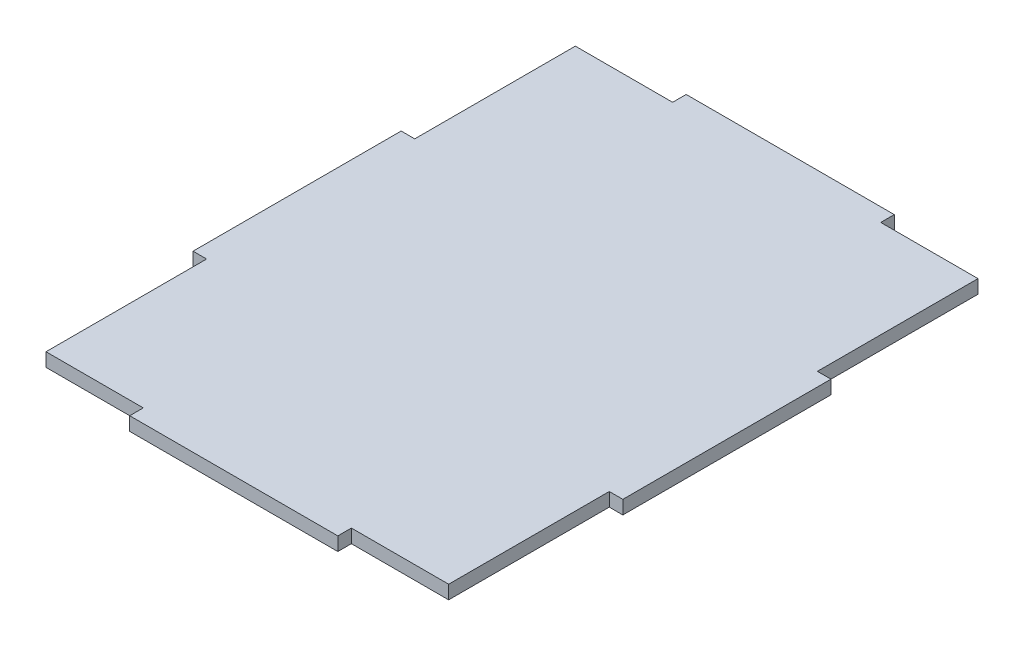
ISO-10303-21;
HEADER;
FILE_DESCRIPTION(('STEP AP214'),'2;1');
FILE_NAME('part.step','',(''),(''),'','','');
FILE_SCHEMA(('AUTOMOTIVE_DESIGN { 1 0 10303 214 1 1 1 1 }'));
ENDSEC;
DATA;
#1=APPLICATION_CONTEXT('core data for automotive mechanical design processes');
#2=APPLICATION_PROTOCOL_DEFINITION('international standard','automotive_design',2000,#1);
#3=PRODUCT_CONTEXT('',#1,'mechanical');
#4=PRODUCT('Part','Part','',(#3));
#5=PRODUCT_RELATED_PRODUCT_CATEGORY('part','',(#4));
#6=PRODUCT_DEFINITION_FORMATION('','',#4);
#7=PRODUCT_DEFINITION_CONTEXT('part definition',#1,'design');
#8=PRODUCT_DEFINITION('design','',#6,#7);
#9=PRODUCT_DEFINITION_SHAPE('','',#8);
#10=(LENGTH_UNIT() NAMED_UNIT(*) SI_UNIT(.MILLI.,.METRE.));
#11=(NAMED_UNIT(*) PLANE_ANGLE_UNIT() SI_UNIT($,.RADIAN.));
#12=(NAMED_UNIT(*) SI_UNIT($,.STERADIAN.) SOLID_ANGLE_UNIT());
#13=UNCERTAINTY_MEASURE_WITH_UNIT(LENGTH_MEASURE(1.E-05),#10,'distance_accuracy_value','');
#14=(GEOMETRIC_REPRESENTATION_CONTEXT(3) GLOBAL_UNCERTAINTY_ASSIGNED_CONTEXT((#13)) GLOBAL_UNIT_ASSIGNED_CONTEXT((#10,
#11,#12)) REPRESENTATION_CONTEXT('',''));
#15=CARTESIAN_POINT('',(0.,0.,0.));
#16=DIRECTION('',(0.,0.,1.));
#17=DIRECTION('',(1.,0.,0.));
#18=AXIS2_PLACEMENT_3D('',#15,#16,#17);
#19=CARTESIAN_POINT('',(0.,3.,-38.5));
#20=DIRECTION('',(0.,0.,-1.));
#21=DIRECTION('',(-1.,0.,0.));
#22=AXIS2_PLACEMENT_3D('',#19,#20,#21);
#23=PLANE('',#22);
#24=DIRECTION('',(1.,0.,0.));
#25=VECTOR('',#24,1.);
#26=CARTESIAN_POINT('',(0.,0.,-38.5));
#27=LINE('',#26,#25);
#28=CARTESIAN_POINT('',(0.,0.,-38.5));
#29=VERTEX_POINT('',#28);
#30=CARTESIAN_POINT('',(3.,0.,-38.5));
#31=VERTEX_POINT('',#30);
#32=EDGE_CURVE('E212',#29,#31,#27,.T.);
#33=ORIENTED_EDGE('',*,*,#32,.T.);
#34=DIRECTION('',(0.,-1.,0.));
#35=VECTOR('',#34,1.);
#36=CARTESIAN_POINT('',(3.,3.,-38.5));
#37=LINE('',#36,#35);
#38=CARTESIAN_POINT('',(3.,3.,-38.5));
#39=VERTEX_POINT('',#38);
#40=EDGE_CURVE('E11',#39,#31,#37,.T.);
#41=ORIENTED_EDGE('',*,*,#40,.F.);
#42=DIRECTION('',(1.,0.,0.));
#43=VECTOR('',#42,1.);
#44=CARTESIAN_POINT('',(0.,3.,-38.5));
#45=LINE('',#44,#43);
#46=CARTESIAN_POINT('',(0.,3.,-38.5));
#47=VERTEX_POINT('',#46);
#48=EDGE_CURVE('E270',#47,#39,#45,.T.);
#49=ORIENTED_EDGE('',*,*,#48,.F.);
#50=DIRECTION('',(0.,-1.,0.));
#51=VECTOR('',#50,1.);
#52=CARTESIAN_POINT('',(0.,3.,-38.5));
#53=LINE('',#52,#51);
#54=EDGE_CURVE('E208',#47,#29,#53,.T.);
#55=ORIENTED_EDGE('',*,*,#54,.T.);
#56=EDGE_LOOP('',(#33,#41,#49,#55));
#57=FACE_BOUND('',#56,.T.);
#58=ADVANCED_FACE('F39',(#57),#23,.F.);
#59=CARTESIAN_POINT('',(3.,3.,-38.5));
#60=DIRECTION('',(1.,0.,0.));
#61=DIRECTION('',(0.,0.,-1.));
#62=AXIS2_PLACEMENT_3D('',#59,#60,#61);
#63=PLANE('',#62);
#64=DIRECTION('',(0.,0.,1.));
#65=VECTOR('',#64,1.);
#66=CARTESIAN_POINT('',(3.,0.,-38.5));
#67=LINE('',#66,#65);
#68=CARTESIAN_POINT('',(3.,0.,-3.));
#69=VERTEX_POINT('',#68);
#70=EDGE_CURVE('E216',#31,#69,#67,.T.);
#71=ORIENTED_EDGE('',*,*,#70,.T.);
#72=DIRECTION('',(0.,-1.,0.));
#73=VECTOR('',#72,1.);
#74=CARTESIAN_POINT('',(3.,3.,-3.));
#75=LINE('',#74,#73);
#76=CARTESIAN_POINT('',(3.,3.,-3.));
#77=VERTEX_POINT('',#76);
#78=EDGE_CURVE('E48',#77,#69,#75,.T.);
#79=ORIENTED_EDGE('',*,*,#78,.F.);
#80=DIRECTION('',(0.,0.,1.));
#81=VECTOR('',#80,1.);
#82=CARTESIAN_POINT('',(3.,3.,-38.5));
#83=LINE('',#82,#81);
#84=EDGE_CURVE('E135',#39,#77,#83,.T.);
#85=ORIENTED_EDGE('',*,*,#84,.F.);
#86=ORIENTED_EDGE('',*,*,#40,.T.);
#87=EDGE_LOOP('',(#71,#79,#85,#86));
#88=FACE_BOUND('',#87,.T.);
#89=ADVANCED_FACE('F420',(#88),#63,.F.);
#90=CARTESIAN_POINT('',(3.,3.,-3.));
#91=DIRECTION('',(0.,0.,-1.));
#92=DIRECTION('',(-1.,0.,0.));
#93=AXIS2_PLACEMENT_3D('',#90,#91,#92);
#94=PLANE('',#93);
#95=DIRECTION('',(1.,0.,0.));
#96=VECTOR('',#95,1.);
#97=CARTESIAN_POINT('',(3.,0.,-3.));
#98=LINE('',#97,#96);
#99=CARTESIAN_POINT('',(24.5,0.,-3.));
#100=VERTEX_POINT('',#99);
#101=EDGE_CURVE('E219',#69,#100,#98,.T.);
#102=ORIENTED_EDGE('',*,*,#101,.T.);
#103=DIRECTION('',(0.,-1.,0.));
#104=VECTOR('',#103,1.);
#105=CARTESIAN_POINT('',(24.5,3.,-3.));
#106=LINE('',#105,#104);
#107=CARTESIAN_POINT('',(24.5,3.,-3.));
#108=VERTEX_POINT('',#107);
#109=EDGE_CURVE('E329',#108,#100,#106,.T.);
#110=ORIENTED_EDGE('',*,*,#109,.F.);
#111=DIRECTION('',(1.,0.,0.));
#112=VECTOR('',#111,1.);
#113=CARTESIAN_POINT('',(3.,3.,-3.));
#114=LINE('',#113,#112);
#115=EDGE_CURVE('E339',#77,#108,#114,.T.);
#116=ORIENTED_EDGE('',*,*,#115,.F.);
#117=ORIENTED_EDGE('',*,*,#78,.T.);
#118=EDGE_LOOP('',(#102,#110,#116,#117));
#119=FACE_BOUND('',#118,.T.);
#120=ADVANCED_FACE('F337',(#119),#94,.F.);
#121=CARTESIAN_POINT('',(24.5,3.,-3.));
#122=DIRECTION('',(1.,0.,0.));
#123=DIRECTION('',(0.,0.,-1.));
#124=AXIS2_PLACEMENT_3D('',#121,#122,#123);
#125=PLANE('',#124);
#126=DIRECTION('',(0.,0.,1.));
#127=VECTOR('',#126,1.);
#128=CARTESIAN_POINT('',(24.5,0.,-3.));
#129=LINE('',#128,#127);
#130=CARTESIAN_POINT('',(24.5,0.,0.));
#131=VERTEX_POINT('',#130);
#132=EDGE_CURVE('E222',#100,#131,#129,.T.);
#133=ORIENTED_EDGE('',*,*,#132,.T.);
#134=DIRECTION('',(0.,-1.,0.));
#135=VECTOR('',#134,1.);
#136=CARTESIAN_POINT('',(24.5,3.,0.));
#137=LINE('',#136,#135);
#138=CARTESIAN_POINT('',(24.5,3.,0.));
#139=VERTEX_POINT('',#138);
#140=EDGE_CURVE('E325',#139,#131,#137,.T.);
#141=ORIENTED_EDGE('',*,*,#140,.F.);
#142=DIRECTION('',(0.,0.,1.));
#143=VECTOR('',#142,1.);
#144=CARTESIAN_POINT('',(24.5,3.,-3.));
#145=LINE('',#144,#143);
#146=EDGE_CURVE('E358',#108,#139,#145,.T.);
#147=ORIENTED_EDGE('',*,*,#146,.F.);
#148=ORIENTED_EDGE('',*,*,#109,.T.);
#149=EDGE_LOOP('',(#133,#141,#147,#148));
#150=FACE_BOUND('',#149,.T.);
#151=ADVANCED_FACE('F348',(#150),#125,.F.);
#152=CARTESIAN_POINT('',(24.5,3.,0.));
#153=DIRECTION('',(0.,0.,-1.));
#154=DIRECTION('',(-1.,0.,0.));
#155=AXIS2_PLACEMENT_3D('',#152,#153,#154);
#156=PLANE('',#155);
#157=DIRECTION('',(1.,0.,0.));
#158=VECTOR('',#157,1.);
#159=CARTESIAN_POINT('',(24.5,0.,0.));
#160=LINE('',#159,#158);
#161=CARTESIAN_POINT('',(70.5,0.,0.));
#162=VERTEX_POINT('',#161);
#163=EDGE_CURVE('E225',#131,#162,#160,.T.);
#164=ORIENTED_EDGE('',*,*,#163,.T.);
#165=DIRECTION('',(0.,-1.,0.));
#166=VECTOR('',#165,1.);
#167=CARTESIAN_POINT('',(70.5,3.,0.));
#168=LINE('',#167,#166);
#169=CARTESIAN_POINT('',(70.5,3.,0.));
#170=VERTEX_POINT('',#169);
#171=EDGE_CURVE('E321',#170,#162,#168,.T.);
#172=ORIENTED_EDGE('',*,*,#171,.F.);
#173=DIRECTION('',(1.,0.,0.));
#174=VECTOR('',#173,1.);
#175=CARTESIAN_POINT('',(24.5,3.,0.));
#176=LINE('',#175,#174);
#177=EDGE_CURVE('E354',#139,#170,#176,.T.);
#178=ORIENTED_EDGE('',*,*,#177,.F.);
#179=ORIENTED_EDGE('',*,*,#140,.T.);
#180=EDGE_LOOP('',(#164,#172,#178,#179));
#181=FACE_BOUND('',#180,.T.);
#182=ADVANCED_FACE('F352',(#181),#156,.F.);
#183=CARTESIAN_POINT('',(70.5,3.,0.));
#184=DIRECTION('',(-1.,0.,0.));
#185=DIRECTION('',(0.,0.,1.));
#186=AXIS2_PLACEMENT_3D('',#183,#184,#185);
#187=PLANE('',#186);
#188=DIRECTION('',(0.,0.,-1.));
#189=VECTOR('',#188,1.);
#190=CARTESIAN_POINT('',(70.5,0.,0.));
#191=LINE('',#190,#189);
#192=CARTESIAN_POINT('',(70.5,0.,-3.));
#193=VERTEX_POINT('',#192);
#194=EDGE_CURVE('E228',#162,#193,#191,.T.);
#195=ORIENTED_EDGE('',*,*,#194,.T.);
#196=DIRECTION('',(0.,-1.,0.));
#197=VECTOR('',#196,1.);
#198=CARTESIAN_POINT('',(70.5,3.,-3.));
#199=LINE('',#198,#197);
#200=CARTESIAN_POINT('',(70.5,3.,-3.));
#201=VERTEX_POINT('',#200);
#202=EDGE_CURVE('E317',#201,#193,#199,.T.);
#203=ORIENTED_EDGE('',*,*,#202,.F.);
#204=DIRECTION('',(0.,0.,-1.));
#205=VECTOR('',#204,1.);
#206=CARTESIAN_POINT('',(70.5,3.,0.));
#207=LINE('',#206,#205);
#208=EDGE_CURVE('E357',#170,#201,#207,.T.);
#209=ORIENTED_EDGE('',*,*,#208,.F.);
#210=ORIENTED_EDGE('',*,*,#171,.T.);
#211=EDGE_LOOP('',(#195,#203,#209,#210));
#212=FACE_BOUND('',#211,.T.);
#213=ADVANCED_FACE('F433',(#212),#187,.F.);
#214=CARTESIAN_POINT('',(70.5,3.,-3.));
#215=DIRECTION('',(0.,0.,-1.));
#216=DIRECTION('',(-1.,0.,0.));
#217=AXIS2_PLACEMENT_3D('',#214,#215,#216);
#218=PLANE('',#217);
#219=DIRECTION('',(1.,0.,0.));
#220=VECTOR('',#219,1.);
#221=CARTESIAN_POINT('',(70.5,0.,-3.));
#222=LINE('',#221,#220);
#223=CARTESIAN_POINT('',(92.,0.,-3.));
#224=VERTEX_POINT('',#223);
#225=EDGE_CURVE('E231',#193,#224,#222,.T.);
#226=ORIENTED_EDGE('',*,*,#225,.T.);
#227=DIRECTION('',(0.,-1.,0.));
#228=VECTOR('',#227,1.);
#229=CARTESIAN_POINT('',(92.,3.,-3.));
#230=LINE('',#229,#228);
#231=CARTESIAN_POINT('',(92.,3.,-3.));
#232=VERTEX_POINT('',#231);
#233=EDGE_CURVE('E313',#232,#224,#230,.T.);
#234=ORIENTED_EDGE('',*,*,#233,.F.);
#235=DIRECTION('',(1.,0.,0.));
#236=VECTOR('',#235,1.);
#237=CARTESIAN_POINT('',(70.5,3.,-3.));
#238=LINE('',#237,#236);
#239=EDGE_CURVE('E362',#201,#232,#238,.T.);
#240=ORIENTED_EDGE('',*,*,#239,.F.);
#241=ORIENTED_EDGE('',*,*,#202,.T.);
#242=EDGE_LOOP('',(#226,#234,#240,#241));
#243=FACE_BOUND('',#242,.T.);
#244=ADVANCED_FACE('F436',(#243),#218,.F.);
#245=CARTESIAN_POINT('',(92.,3.,-3.));
#246=DIRECTION('',(-1.,0.,0.));
#247=DIRECTION('',(0.,0.,1.));
#248=AXIS2_PLACEMENT_3D('',#245,#246,#247);
#249=PLANE('',#248);
#250=DIRECTION('',(0.,0.,-1.));
#251=VECTOR('',#250,1.);
#252=CARTESIAN_POINT('',(92.,0.,-3.));
#253=LINE('',#252,#251);
#254=CARTESIAN_POINT('',(92.,0.,-38.5));
#255=VERTEX_POINT('',#254);
#256=EDGE_CURVE('E234',#224,#255,#253,.T.);
#257=ORIENTED_EDGE('',*,*,#256,.T.);
#258=DIRECTION('',(0.,-1.,0.));
#259=VECTOR('',#258,1.);
#260=CARTESIAN_POINT('',(92.,3.,-38.5));
#261=LINE('',#260,#259);
#262=CARTESIAN_POINT('',(92.,3.,-38.5));
#263=VERTEX_POINT('',#262);
#264=EDGE_CURVE('E309',#263,#255,#261,.T.);
#265=ORIENTED_EDGE('',*,*,#264,.F.);
#266=DIRECTION('',(0.,0.,-1.));
#267=VECTOR('',#266,1.);
#268=CARTESIAN_POINT('',(92.,3.,-3.));
#269=LINE('',#268,#267);
#270=EDGE_CURVE('E369',#232,#263,#269,.T.);
#271=ORIENTED_EDGE('',*,*,#270,.F.);
#272=ORIENTED_EDGE('',*,*,#233,.T.);
#273=EDGE_LOOP('',(#257,#265,#271,#272));
#274=FACE_BOUND('',#273,.T.);
#275=ADVANCED_FACE('F440',(#274),#249,.F.);
#276=CARTESIAN_POINT('',(92.,3.,-38.5));
#277=DIRECTION('',(0.,0.,-1.));
#278=DIRECTION('',(-1.,0.,0.));
#279=AXIS2_PLACEMENT_3D('',#276,#277,#278);
#280=PLANE('',#279);
#281=DIRECTION('',(1.,0.,0.));
#282=VECTOR('',#281,1.);
#283=CARTESIAN_POINT('',(92.,0.,-38.5));
#284=LINE('',#283,#282);
#285=CARTESIAN_POINT('',(95.,0.,-38.5));
#286=VERTEX_POINT('',#285);
#287=EDGE_CURVE('E237',#255,#286,#284,.T.);
#288=ORIENTED_EDGE('',*,*,#287,.T.);
#289=DIRECTION('',(0.,-1.,0.));
#290=VECTOR('',#289,1.);
#291=CARTESIAN_POINT('',(95.,3.,-38.5));
#292=LINE('',#291,#290);
#293=CARTESIAN_POINT('',(95.,3.,-38.5));
#294=VERTEX_POINT('',#293);
#295=EDGE_CURVE('E305',#294,#286,#292,.T.);
#296=ORIENTED_EDGE('',*,*,#295,.F.);
#297=DIRECTION('',(1.,0.,0.));
#298=VECTOR('',#297,1.);
#299=CARTESIAN_POINT('',(92.,3.,-38.5));
#300=LINE('',#299,#298);
#301=EDGE_CURVE('E372',#263,#294,#300,.T.);
#302=ORIENTED_EDGE('',*,*,#301,.F.);
#303=ORIENTED_EDGE('',*,*,#264,.T.);
#304=EDGE_LOOP('',(#288,#296,#302,#303));
#305=FACE_BOUND('',#304,.T.);
#306=ADVANCED_FACE('F444',(#305),#280,.F.);
#307=CARTESIAN_POINT('',(95.,3.,-38.5));
#308=DIRECTION('',(-1.,0.,0.));
#309=DIRECTION('',(0.,0.,1.));
#310=AXIS2_PLACEMENT_3D('',#307,#308,#309);
#311=PLANE('',#310);
#312=DIRECTION('',(0.,0.,-1.));
#313=VECTOR('',#312,1.);
#314=CARTESIAN_POINT('',(95.,0.,-38.5));
#315=LINE('',#314,#313);
#316=CARTESIAN_POINT('',(95.,0.,-84.5));
#317=VERTEX_POINT('',#316);
#318=EDGE_CURVE('E240',#286,#317,#315,.T.);
#319=ORIENTED_EDGE('',*,*,#318,.T.);
#320=DIRECTION('',(0.,-1.,0.));
#321=VECTOR('',#320,1.);
#322=CARTESIAN_POINT('',(95.,3.,-84.5));
#323=LINE('',#322,#321);
#324=CARTESIAN_POINT('',(95.,3.,-84.5));
#325=VERTEX_POINT('',#324);
#326=EDGE_CURVE('E301',#325,#317,#323,.T.);
#327=ORIENTED_EDGE('',*,*,#326,.F.);
#328=DIRECTION('',(0.,0.,-1.));
#329=VECTOR('',#328,1.);
#330=CARTESIAN_POINT('',(95.,3.,-38.5));
#331=LINE('',#330,#329);
#332=EDGE_CURVE('E375',#294,#325,#331,.T.);
#333=ORIENTED_EDGE('',*,*,#332,.F.);
#334=ORIENTED_EDGE('',*,*,#295,.T.);
#335=EDGE_LOOP('',(#319,#327,#333,#334));
#336=FACE_BOUND('',#335,.T.);
#337=ADVANCED_FACE('F448',(#336),#311,.F.);
#338=CARTESIAN_POINT('',(95.,3.,-84.5));
#339=DIRECTION('',(0.,0.,1.));
#340=DIRECTION('',(1.,0.,0.));
#341=AXIS2_PLACEMENT_3D('',#338,#339,#340);
#342=PLANE('',#341);
#343=DIRECTION('',(-1.,0.,0.));
#344=VECTOR('',#343,1.);
#345=CARTESIAN_POINT('',(95.,0.,-84.5));
#346=LINE('',#345,#344);
#347=CARTESIAN_POINT('',(92.,0.,-84.5));
#348=VERTEX_POINT('',#347);
#349=EDGE_CURVE('E243',#317,#348,#346,.T.);
#350=ORIENTED_EDGE('',*,*,#349,.T.);
#351=DIRECTION('',(0.,-1.,0.));
#352=VECTOR('',#351,1.);
#353=CARTESIAN_POINT('',(92.,3.,-84.5));
#354=LINE('',#353,#352);
#355=CARTESIAN_POINT('',(92.,3.,-84.5));
#356=VERTEX_POINT('',#355);
#357=EDGE_CURVE('E297',#356,#348,#354,.T.);
#358=ORIENTED_EDGE('',*,*,#357,.F.);
#359=DIRECTION('',(-1.,0.,0.));
#360=VECTOR('',#359,1.);
#361=CARTESIAN_POINT('',(95.,3.,-84.5));
#362=LINE('',#361,#360);
#363=EDGE_CURVE('E378',#325,#356,#362,.T.);
#364=ORIENTED_EDGE('',*,*,#363,.F.);
#365=ORIENTED_EDGE('',*,*,#326,.T.);
#366=EDGE_LOOP('',(#350,#358,#364,#365));
#367=FACE_BOUND('',#366,.T.);
#368=ADVANCED_FACE('F452',(#367),#342,.F.);
#369=CARTESIAN_POINT('',(92.,3.,-84.5));
#370=DIRECTION('',(-1.,0.,0.));
#371=DIRECTION('',(0.,0.,1.));
#372=AXIS2_PLACEMENT_3D('',#369,#370,#371);
#373=PLANE('',#372);
#374=DIRECTION('',(0.,0.,-1.));
#375=VECTOR('',#374,1.);
#376=CARTESIAN_POINT('',(92.,0.,-84.5));
#377=LINE('',#376,#375);
#378=CARTESIAN_POINT('',(92.,0.,-120.));
#379=VERTEX_POINT('',#378);
#380=EDGE_CURVE('E246',#348,#379,#377,.T.);
#381=ORIENTED_EDGE('',*,*,#380,.T.);
#382=DIRECTION('',(0.,-1.,0.));
#383=VECTOR('',#382,1.);
#384=CARTESIAN_POINT('',(92.,3.,-120.));
#385=LINE('',#384,#383);
#386=CARTESIAN_POINT('',(92.,3.,-120.));
#387=VERTEX_POINT('',#386);
#388=EDGE_CURVE('E293',#387,#379,#385,.T.);
#389=ORIENTED_EDGE('',*,*,#388,.F.);
#390=DIRECTION('',(0.,0.,-1.));
#391=VECTOR('',#390,1.);
#392=CARTESIAN_POINT('',(92.,3.,-84.5));
#393=LINE('',#392,#391);
#394=EDGE_CURVE('E381',#356,#387,#393,.T.);
#395=ORIENTED_EDGE('',*,*,#394,.F.);
#396=ORIENTED_EDGE('',*,*,#357,.T.);
#397=EDGE_LOOP('',(#381,#389,#395,#396));
#398=FACE_BOUND('',#397,.T.);
#399=ADVANCED_FACE('F456',(#398),#373,.F.);
#400=CARTESIAN_POINT('',(92.,3.,-120.));
#401=DIRECTION('',(0.,0.,1.));
#402=DIRECTION('',(1.,0.,0.));
#403=AXIS2_PLACEMENT_3D('',#400,#401,#402);
#404=PLANE('',#403);
#405=DIRECTION('',(-1.,0.,0.));
#406=VECTOR('',#405,1.);
#407=CARTESIAN_POINT('',(92.,0.,-120.));
#408=LINE('',#407,#406);
#409=CARTESIAN_POINT('',(70.5,0.,-120.));
#410=VERTEX_POINT('',#409);
#411=EDGE_CURVE('E249',#379,#410,#408,.T.);
#412=ORIENTED_EDGE('',*,*,#411,.T.);
#413=DIRECTION('',(0.,-1.,0.));
#414=VECTOR('',#413,1.);
#415=CARTESIAN_POINT('',(70.5,3.,-120.));
#416=LINE('',#415,#414);
#417=CARTESIAN_POINT('',(70.5,3.,-120.));
#418=VERTEX_POINT('',#417);
#419=EDGE_CURVE('E289',#418,#410,#416,.T.);
#420=ORIENTED_EDGE('',*,*,#419,.F.);
#421=DIRECTION('',(-1.,0.,0.));
#422=VECTOR('',#421,1.);
#423=CARTESIAN_POINT('',(92.,3.,-120.));
#424=LINE('',#423,#422);
#425=EDGE_CURVE('E384',#387,#418,#424,.T.);
#426=ORIENTED_EDGE('',*,*,#425,.F.);
#427=ORIENTED_EDGE('',*,*,#388,.T.);
#428=EDGE_LOOP('',(#412,#420,#426,#427));
#429=FACE_BOUND('',#428,.T.);
#430=ADVANCED_FACE('F460',(#429),#404,.F.);
#431=CARTESIAN_POINT('',(70.5,3.,-120.));
#432=DIRECTION('',(-1.,0.,0.));
#433=DIRECTION('',(0.,0.,1.));
#434=AXIS2_PLACEMENT_3D('',#431,#432,#433);
#435=PLANE('',#434);
#436=DIRECTION('',(0.,0.,-1.));
#437=VECTOR('',#436,1.);
#438=CARTESIAN_POINT('',(70.5,0.,-120.));
#439=LINE('',#438,#437);
#440=CARTESIAN_POINT('',(70.5,0.,-123.));
#441=VERTEX_POINT('',#440);
#442=EDGE_CURVE('E252',#410,#441,#439,.T.);
#443=ORIENTED_EDGE('',*,*,#442,.T.);
#444=DIRECTION('',(0.,-1.,0.));
#445=VECTOR('',#444,1.);
#446=CARTESIAN_POINT('',(70.5,3.,-123.));
#447=LINE('',#446,#445);
#448=CARTESIAN_POINT('',(70.5,3.,-123.));
#449=VERTEX_POINT('',#448);
#450=EDGE_CURVE('E285',#449,#441,#447,.T.);
#451=ORIENTED_EDGE('',*,*,#450,.F.);
#452=DIRECTION('',(0.,0.,-1.));
#453=VECTOR('',#452,1.);
#454=CARTESIAN_POINT('',(70.5,3.,-120.));
#455=LINE('',#454,#453);
#456=EDGE_CURVE('E387',#418,#449,#455,.T.);
#457=ORIENTED_EDGE('',*,*,#456,.F.);
#458=ORIENTED_EDGE('',*,*,#419,.T.);
#459=EDGE_LOOP('',(#443,#451,#457,#458));
#460=FACE_BOUND('',#459,.T.);
#461=ADVANCED_FACE('F464',(#460),#435,.F.);
#462=CARTESIAN_POINT('',(70.5,3.,-123.));
#463=DIRECTION('',(0.,0.,1.));
#464=DIRECTION('',(1.,0.,0.));
#465=AXIS2_PLACEMENT_3D('',#462,#463,#464);
#466=PLANE('',#465);
#467=DIRECTION('',(-1.,0.,0.));
#468=VECTOR('',#467,1.);
#469=CARTESIAN_POINT('',(70.5,0.,-123.));
#470=LINE('',#469,#468);
#471=CARTESIAN_POINT('',(24.5,0.,-123.));
#472=VERTEX_POINT('',#471);
#473=EDGE_CURVE('E255',#441,#472,#470,.T.);
#474=ORIENTED_EDGE('',*,*,#473,.T.);
#475=DIRECTION('',(0.,-1.,0.));
#476=VECTOR('',#475,1.);
#477=CARTESIAN_POINT('',(24.5,3.,-123.));
#478=LINE('',#477,#476);
#479=CARTESIAN_POINT('',(24.5,3.,-123.));
#480=VERTEX_POINT('',#479);
#481=EDGE_CURVE('E281',#480,#472,#478,.T.);
#482=ORIENTED_EDGE('',*,*,#481,.F.);
#483=DIRECTION('',(-1.,0.,0.));
#484=VECTOR('',#483,1.);
#485=CARTESIAN_POINT('',(70.5,3.,-123.));
#486=LINE('',#485,#484);
#487=EDGE_CURVE('E390',#449,#480,#486,.T.);
#488=ORIENTED_EDGE('',*,*,#487,.F.);
#489=ORIENTED_EDGE('',*,*,#450,.T.);
#490=EDGE_LOOP('',(#474,#482,#488,#489));
#491=FACE_BOUND('',#490,.T.);
#492=ADVANCED_FACE('F468',(#491),#466,.F.);
#493=CARTESIAN_POINT('',(24.5,3.,-123.));
#494=DIRECTION('',(1.,0.,0.));
#495=DIRECTION('',(0.,0.,-1.));
#496=AXIS2_PLACEMENT_3D('',#493,#494,#495);
#497=PLANE('',#496);
#498=DIRECTION('',(0.,0.,1.));
#499=VECTOR('',#498,1.);
#500=CARTESIAN_POINT('',(24.5,0.,-123.));
#501=LINE('',#500,#499);
#502=CARTESIAN_POINT('',(24.5,0.,-120.));
#503=VERTEX_POINT('',#502);
#504=EDGE_CURVE('E258',#472,#503,#501,.T.);
#505=ORIENTED_EDGE('',*,*,#504,.T.);
#506=DIRECTION('',(0.,-1.,0.));
#507=VECTOR('',#506,1.);
#508=CARTESIAN_POINT('',(24.5,3.,-120.));
#509=LINE('',#508,#507);
#510=CARTESIAN_POINT('',(24.5,3.,-120.));
#511=VERTEX_POINT('',#510);
#512=EDGE_CURVE('E277',#511,#503,#509,.T.);
#513=ORIENTED_EDGE('',*,*,#512,.F.);
#514=DIRECTION('',(0.,0.,1.));
#515=VECTOR('',#514,1.);
#516=CARTESIAN_POINT('',(24.5,3.,-123.));
#517=LINE('',#516,#515);
#518=EDGE_CURVE('E393',#480,#511,#517,.T.);
#519=ORIENTED_EDGE('',*,*,#518,.F.);
#520=ORIENTED_EDGE('',*,*,#481,.T.);
#521=EDGE_LOOP('',(#505,#513,#519,#520));
#522=FACE_BOUND('',#521,.T.);
#523=ADVANCED_FACE('F401',(#522),#497,.F.);
#524=CARTESIAN_POINT('',(24.5,3.,-120.));
#525=DIRECTION('',(0.,0.,1.));
#526=DIRECTION('',(1.,0.,0.));
#527=AXIS2_PLACEMENT_3D('',#524,#525,#526);
#528=PLANE('',#527);
#529=DIRECTION('',(-1.,0.,0.));
#530=VECTOR('',#529,1.);
#531=CARTESIAN_POINT('',(24.5,0.,-120.));
#532=LINE('',#531,#530);
#533=CARTESIAN_POINT('',(2.99999999999999,0.,-120.));
#534=VERTEX_POINT('',#533);
#535=EDGE_CURVE('E261',#503,#534,#532,.T.);
#536=ORIENTED_EDGE('',*,*,#535,.T.);
#537=DIRECTION('',(0.,-1.,0.));
#538=VECTOR('',#537,1.);
#539=CARTESIAN_POINT('',(2.99999999999999,3.,-120.));
#540=LINE('',#539,#538);
#541=CARTESIAN_POINT('',(2.99999999999999,3.,-120.));
#542=VERTEX_POINT('',#541);
#543=EDGE_CURVE('E201',#542,#534,#540,.T.);
#544=ORIENTED_EDGE('',*,*,#543,.F.);
#545=DIRECTION('',(-1.,0.,0.));
#546=VECTOR('',#545,1.);
#547=CARTESIAN_POINT('',(24.5,3.,-120.));
#548=LINE('',#547,#546);
#549=EDGE_CURVE('E190',#511,#542,#548,.T.);
#550=ORIENTED_EDGE('',*,*,#549,.F.);
#551=ORIENTED_EDGE('',*,*,#512,.T.);
#552=EDGE_LOOP('',(#536,#544,#550,#551));
#553=FACE_BOUND('',#552,.T.);
#554=ADVANCED_FACE('F405',(#553),#528,.F.);
#555=CARTESIAN_POINT('',(2.99999999999999,3.,-120.));
#556=DIRECTION('',(1.,0.,0.));
#557=DIRECTION('',(0.,0.,-1.));
#558=AXIS2_PLACEMENT_3D('',#555,#556,#557);
#559=PLANE('',#558);
#560=DIRECTION('',(0.,0.,1.));
#561=VECTOR('',#560,1.);
#562=CARTESIAN_POINT('',(2.99999999999999,0.,-120.));
#563=LINE('',#562,#561);
#564=CARTESIAN_POINT('',(3.,0.,-84.5));
#565=VERTEX_POINT('',#564);
#566=EDGE_CURVE('E199',#534,#565,#563,.T.);
#567=ORIENTED_EDGE('',*,*,#566,.T.);
#568=DIRECTION('',(0.,-1.,0.));
#569=VECTOR('',#568,1.);
#570=CARTESIAN_POINT('',(3.,3.,-84.5));
#571=LINE('',#570,#569);
#572=CARTESIAN_POINT('',(3.,3.,-84.5));
#573=VERTEX_POINT('',#572);
#574=EDGE_CURVE('E196',#573,#565,#571,.T.);
#575=ORIENTED_EDGE('',*,*,#574,.F.);
#576=DIRECTION('',(0.,0.,1.));
#577=VECTOR('',#576,1.);
#578=CARTESIAN_POINT('',(2.99999999999999,3.,-120.));
#579=LINE('',#578,#577);
#580=EDGE_CURVE('E184',#542,#573,#579,.T.);
#581=ORIENTED_EDGE('',*,*,#580,.F.);
#582=ORIENTED_EDGE('',*,*,#543,.T.);
#583=EDGE_LOOP('',(#567,#575,#581,#582));
#584=FACE_BOUND('',#583,.T.);
#585=ADVANCED_FACE('F197',(#584),#559,.F.);
#586=CARTESIAN_POINT('',(3.,3.,-84.5));
#587=DIRECTION('',(0.,0.,1.));
#588=DIRECTION('',(1.,0.,0.));
#589=AXIS2_PLACEMENT_3D('',#586,#587,#588);
#590=PLANE('',#589);
#591=DIRECTION('',(-1.,0.,0.));
#592=VECTOR('',#591,1.);
#593=CARTESIAN_POINT('',(3.,0.,-84.5));
#594=LINE('',#593,#592);
#595=CARTESIAN_POINT('',(0.,0.,-84.5));
#596=VERTEX_POINT('',#595);
#597=EDGE_CURVE('E121',#565,#596,#594,.T.);
#598=ORIENTED_EDGE('',*,*,#597,.T.);
#599=DIRECTION('',(0.,-1.,0.));
#600=VECTOR('',#599,1.);
#601=CARTESIAN_POINT('',(0.,3.,-84.5));
#602=LINE('',#601,#600);
#603=CARTESIAN_POINT('',(0.,3.,-84.5));
#604=VERTEX_POINT('',#603);
#605=EDGE_CURVE('E202',#604,#596,#602,.T.);
#606=ORIENTED_EDGE('',*,*,#605,.F.);
#607=DIRECTION('',(-1.,0.,0.));
#608=VECTOR('',#607,1.);
#609=CARTESIAN_POINT('',(3.,3.,-84.5));
#610=LINE('',#609,#608);
#611=EDGE_CURVE('E188',#573,#604,#610,.T.);
#612=ORIENTED_EDGE('',*,*,#611,.F.);
#613=ORIENTED_EDGE('',*,*,#574,.T.);
#614=EDGE_LOOP('',(#598,#606,#612,#613));
#615=FACE_BOUND('',#614,.T.);
#616=ADVANCED_FACE('F204',(#615),#590,.F.);
#617=CARTESIAN_POINT('',(0.,3.,-84.5));
#618=DIRECTION('',(1.,0.,0.));
#619=DIRECTION('',(0.,0.,-1.));
#620=AXIS2_PLACEMENT_3D('',#617,#618,#619);
#621=PLANE('',#620);
#622=DIRECTION('',(0.,0.,1.));
#623=VECTOR('',#622,1.);
#624=CARTESIAN_POINT('',(0.,0.,-84.5));
#625=LINE('',#624,#623);
#626=EDGE_CURVE('E127',#596,#29,#625,.T.);
#627=ORIENTED_EDGE('',*,*,#626,.T.);
#628=ORIENTED_EDGE('',*,*,#54,.F.);
#629=DIRECTION('',(0.,0.,1.));
#630=VECTOR('',#629,1.);
#631=CARTESIAN_POINT('',(0.,3.,-84.5));
#632=LINE('',#631,#630);
#633=EDGE_CURVE('E56',#604,#47,#632,.T.);
#634=ORIENTED_EDGE('',*,*,#633,.F.);
#635=ORIENTED_EDGE('',*,*,#605,.T.);
#636=EDGE_LOOP('',(#627,#628,#634,#635));
#637=FACE_BOUND('',#636,.T.);
#638=ADVANCED_FACE('F409',(#637),#621,.F.);
#639=CARTESIAN_POINT('',(0.,3.,0.));
#640=DIRECTION('',(0.,-1.,0.));
#641=DIRECTION('',(0.,0.,-1.));
#642=AXIS2_PLACEMENT_3D('',#639,#640,#641);
#643=PLANE('',#642);
#644=ORIENTED_EDGE('',*,*,#48,.T.);
#645=ORIENTED_EDGE('',*,*,#84,.T.);
#646=ORIENTED_EDGE('',*,*,#115,.T.);
#647=ORIENTED_EDGE('',*,*,#146,.T.);
#648=ORIENTED_EDGE('',*,*,#177,.T.);
#649=ORIENTED_EDGE('',*,*,#208,.T.);
#650=ORIENTED_EDGE('',*,*,#239,.T.);
#651=ORIENTED_EDGE('',*,*,#270,.T.);
#652=ORIENTED_EDGE('',*,*,#301,.T.);
#653=ORIENTED_EDGE('',*,*,#332,.T.);
#654=ORIENTED_EDGE('',*,*,#363,.T.);
#655=ORIENTED_EDGE('',*,*,#394,.T.);
#656=ORIENTED_EDGE('',*,*,#425,.T.);
#657=ORIENTED_EDGE('',*,*,#456,.T.);
#658=ORIENTED_EDGE('',*,*,#487,.T.);
#659=ORIENTED_EDGE('',*,*,#518,.T.);
#660=ORIENTED_EDGE('',*,*,#549,.T.);
#661=ORIENTED_EDGE('',*,*,#580,.T.);
#662=ORIENTED_EDGE('',*,*,#611,.T.);
#663=ORIENTED_EDGE('',*,*,#633,.T.);
#664=EDGE_LOOP('',(#644,#645,#646,#647,#648,#649,#650,#651,#652,#653,#654,#655,#656,#657,#658,
#659,#660,#661,#662,#663));
#665=FACE_BOUND('',#664,.T.);
#666=ADVANCED_FACE('F186',(#665),#643,.F.);
#667=CARTESIAN_POINT('',(0.,0.,0.));
#668=DIRECTION('',(0.,-1.,0.));
#669=DIRECTION('',(0.,0.,-1.));
#670=AXIS2_PLACEMENT_3D('',#667,#668,#669);
#671=PLANE('',#670);
#672=ORIENTED_EDGE('',*,*,#32,.F.);
#673=ORIENTED_EDGE('',*,*,#626,.F.);
#674=ORIENTED_EDGE('',*,*,#597,.F.);
#675=ORIENTED_EDGE('',*,*,#566,.F.);
#676=ORIENTED_EDGE('',*,*,#535,.F.);
#677=ORIENTED_EDGE('',*,*,#504,.F.);
#678=ORIENTED_EDGE('',*,*,#473,.F.);
#679=ORIENTED_EDGE('',*,*,#442,.F.);
#680=ORIENTED_EDGE('',*,*,#411,.F.);
#681=ORIENTED_EDGE('',*,*,#380,.F.);
#682=ORIENTED_EDGE('',*,*,#349,.F.);
#683=ORIENTED_EDGE('',*,*,#318,.F.);
#684=ORIENTED_EDGE('',*,*,#287,.F.);
#685=ORIENTED_EDGE('',*,*,#256,.F.);
#686=ORIENTED_EDGE('',*,*,#225,.F.);
#687=ORIENTED_EDGE('',*,*,#194,.F.);
#688=ORIENTED_EDGE('',*,*,#163,.F.);
#689=ORIENTED_EDGE('',*,*,#132,.F.);
#690=ORIENTED_EDGE('',*,*,#101,.F.);
#691=ORIENTED_EDGE('',*,*,#70,.F.);
#692=EDGE_LOOP('',(#672,#673,#674,#675,#676,#677,#678,#679,#680,#681,#682,#683,#684,#685,#686,
#687,#688,#689,#690,#691));
#693=FACE_BOUND('',#692,.T.);
#694=ADVANCED_FACE('F343',(#693),#671,.T.);
#695=CLOSED_SHELL('',(#58,#89,#120,#151,#182,#213,#244,#275,#306,#337,#368,#399,#430,#461,#492,
#523,#554,#585,#616,#638,#666,#694));
#696=MANIFOLD_SOLID_BREP('B2',#695);
#697=ADVANCED_BREP_SHAPE_REPRESENTATION('',(#18,#696),#14);
#698=SHAPE_DEFINITION_REPRESENTATION(#9,#697);
ENDSEC;
END-ISO-10303-21;
